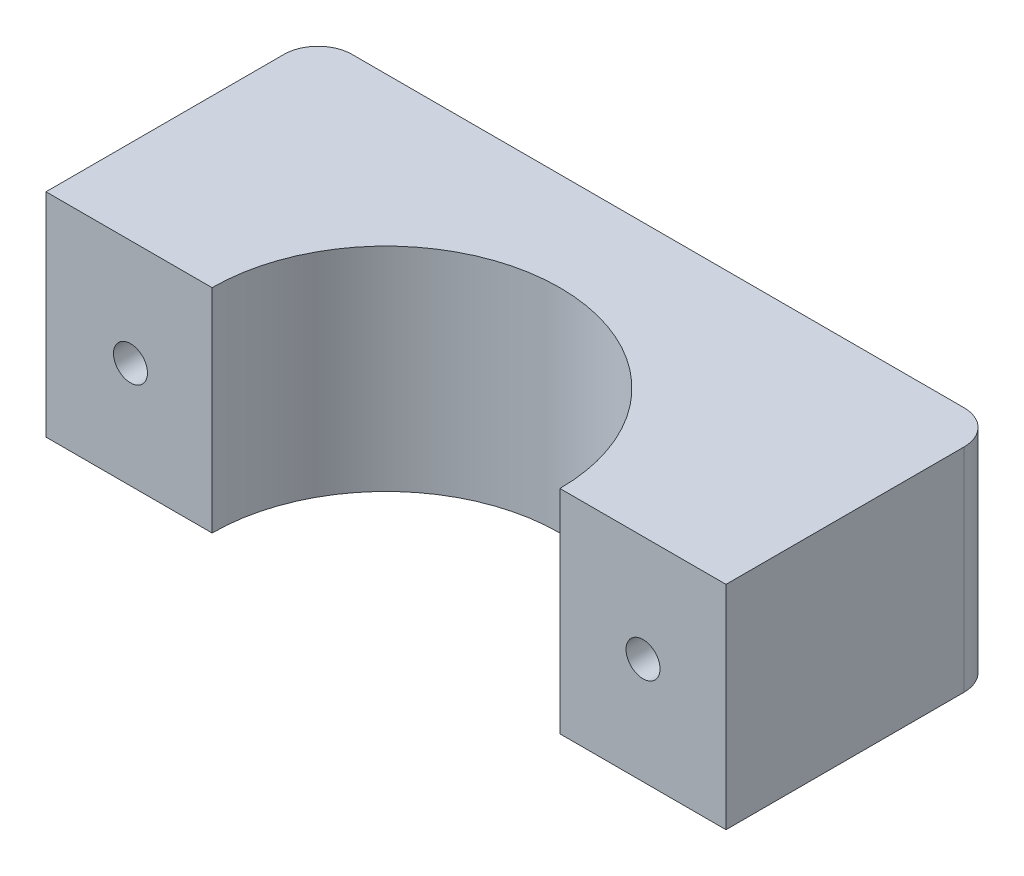
ISO-10303-21;
HEADER;
FILE_DESCRIPTION(('STEP AP214'),'2;1');
FILE_NAME('part.step','',(''),(''),'','','');
FILE_SCHEMA(('AUTOMOTIVE_DESIGN { 1 0 10303 214 1 1 1 1 }'));
ENDSEC;
DATA;
#1=APPLICATION_CONTEXT('core data for automotive mechanical design processes');
#2=APPLICATION_PROTOCOL_DEFINITION('international standard','automotive_design',2000,#1);
#3=PRODUCT_CONTEXT('',#1,'mechanical');
#4=PRODUCT('Part','Part','',(#3));
#5=PRODUCT_RELATED_PRODUCT_CATEGORY('part','',(#4));
#6=PRODUCT_DEFINITION_FORMATION('','',#4);
#7=PRODUCT_DEFINITION_CONTEXT('part definition',#1,'design');
#8=PRODUCT_DEFINITION('design','',#6,#7);
#9=PRODUCT_DEFINITION_SHAPE('','',#8);
#10=(LENGTH_UNIT() NAMED_UNIT(*) SI_UNIT(.MILLI.,.METRE.));
#11=(NAMED_UNIT(*) PLANE_ANGLE_UNIT() SI_UNIT($,.RADIAN.));
#12=(NAMED_UNIT(*) SI_UNIT($,.STERADIAN.) SOLID_ANGLE_UNIT());
#13=UNCERTAINTY_MEASURE_WITH_UNIT(LENGTH_MEASURE(1.E-05),#10,'distance_accuracy_value','');
#14=(GEOMETRIC_REPRESENTATION_CONTEXT(3) GLOBAL_UNCERTAINTY_ASSIGNED_CONTEXT((#13)) GLOBAL_UNIT_ASSIGNED_CONTEXT((#10,
#11,#12)) REPRESENTATION_CONTEXT('',''));
#15=CARTESIAN_POINT('',(0.,0.,0.));
#16=DIRECTION('',(0.,0.,1.));
#17=DIRECTION('',(1.,0.,0.));
#18=AXIS2_PLACEMENT_3D('',#15,#16,#17);
#19=CARTESIAN_POINT('',(44.6024,7.9375,0.));
#20=DIRECTION('',(0.,0.,1.));
#21=DIRECTION('',(1.,0.,0.));
#22=AXIS2_PLACEMENT_3D('',#19,#20,#21);
#23=CYLINDRICAL_SURFACE('',#22,1.27);
#24=CARTESIAN_POINT('',(44.6024,7.9375,20.32));
#25=DIRECTION('',(0.,0.,1.));
#26=DIRECTION('',(1.,0.,0.));
#27=AXIS2_PLACEMENT_3D('',#24,#25,#26);
#28=CIRCLE('',#27,1.27);
#29=CARTESIAN_POINT('',(45.8724,7.9375,20.32));
#30=VERTEX_POINT('',#29);
#31=EDGE_CURVE('E301',#30,#30,#28,.T.);
#32=ORIENTED_EDGE('',*,*,#31,.T.);
#33=EDGE_LOOP('',(#32));
#34=FACE_BOUND('',#33,.T.);
#35=CARTESIAN_POINT('',(44.6024,7.9375,4.1275));
#36=DIRECTION('',(0.,0.,-1.));
#37=DIRECTION('',(-1.,0.,0.));
#38=AXIS2_PLACEMENT_3D('',#35,#36,#37);
#39=CIRCLE('',#38,1.27);
#40=CARTESIAN_POINT('',(43.3324,7.9375,4.1275));
#41=VERTEX_POINT('',#40);
#42=EDGE_CURVE('E297',#41,#41,#39,.F.);
#43=ORIENTED_EDGE('',*,*,#42,.F.);
#44=EDGE_LOOP('',(#43));
#45=FACE_BOUND('',#44,.T.);
#46=ADVANCED_FACE('F41',(#34,#45),#23,.F.);
#47=CARTESIAN_POINT('',(6.3119,7.9375,0.));
#48=DIRECTION('',(0.,0.,1.));
#49=DIRECTION('',(1.,0.,0.));
#50=AXIS2_PLACEMENT_3D('',#47,#48,#49);
#51=CYLINDRICAL_SURFACE('',#50,1.27);
#52=CARTESIAN_POINT('',(6.3119,7.9375,20.32));
#53=DIRECTION('',(0.,0.,1.));
#54=DIRECTION('',(1.,0.,0.));
#55=AXIS2_PLACEMENT_3D('',#52,#53,#54);
#56=CIRCLE('',#55,1.27);
#57=CARTESIAN_POINT('',(7.5819,7.9375,20.32));
#58=VERTEX_POINT('',#57);
#59=EDGE_CURVE('E146',#58,#58,#56,.T.);
#60=ORIENTED_EDGE('',*,*,#59,.T.);
#61=EDGE_LOOP('',(#60));
#62=FACE_BOUND('',#61,.T.);
#63=CARTESIAN_POINT('',(6.3119,7.9375,4.1275));
#64=DIRECTION('',(0.,0.,-1.));
#65=DIRECTION('',(-1.,0.,0.));
#66=AXIS2_PLACEMENT_3D('',#63,#64,#65);
#67=CIRCLE('',#66,1.27);
#68=CARTESIAN_POINT('',(5.04189999999999,7.9375,4.1275));
#69=VERTEX_POINT('',#68);
#70=EDGE_CURVE('E294',#69,#69,#67,.F.);
#71=ORIENTED_EDGE('',*,*,#70,.F.);
#72=EDGE_LOOP('',(#71));
#73=FACE_BOUND('',#72,.T.);
#74=ADVANCED_FACE('F208',(#62,#73),#51,.F.);
#75=CARTESIAN_POINT('',(0.,15.875,0.));
#76=DIRECTION('',(0.,0.,-1.));
#77=DIRECTION('',(-1.,0.,0.));
#78=AXIS2_PLACEMENT_3D('',#75,#76,#77);
#79=PLANE('',#78);
#80=CARTESIAN_POINT('',(44.6024,7.9375,0.));
#81=DIRECTION('',(0.,0.,-1.));
#82=DIRECTION('',(-1.,0.,0.));
#83=AXIS2_PLACEMENT_3D('',#80,#81,#82);
#84=CIRCLE('',#83,3.81);
#85=CARTESIAN_POINT('',(48.26,6.87069999999999,0.));
#86=VERTEX_POINT('',#85);
#87=CARTESIAN_POINT('',(48.26,9.00430000000001,0.));
#88=VERTEX_POINT('',#87);
#89=EDGE_CURVE('E68',#86,#88,#84,.T.);
#90=ORIENTED_EDGE('',*,*,#89,.F.);
#91=DIRECTION('',(0.,-1.,0.));
#92=VECTOR('',#91,1.);
#93=CARTESIAN_POINT('',(48.26,15.875,0.));
#94=LINE('',#93,#92);
#95=CARTESIAN_POINT('',(48.26,0.,0.));
#96=VERTEX_POINT('',#95);
#97=EDGE_CURVE('E129',#86,#96,#94,.T.);
#98=ORIENTED_EDGE('',*,*,#97,.T.);
#99=DIRECTION('',(1.,0.,0.));
#100=VECTOR('',#99,1.);
#101=CARTESIAN_POINT('',(0.,0.,0.));
#102=LINE('',#101,#100);
#103=CARTESIAN_POINT('',(2.54000000000002,0.,0.));
#104=VERTEX_POINT('',#103);
#105=EDGE_CURVE('E132',#104,#96,#102,.T.);
#106=ORIENTED_EDGE('',*,*,#105,.F.);
#107=DIRECTION('',(0.,-1.,0.));
#108=VECTOR('',#107,1.);
#109=CARTESIAN_POINT('',(2.54000000000002,15.875,0.));
#110=LINE('',#109,#108);
#111=CARTESIAN_POINT('',(2.54000000000001,7.40003335917463,0.));
#112=VERTEX_POINT('',#111);
#113=EDGE_CURVE('E233',#112,#104,#110,.T.);
#114=ORIENTED_EDGE('',*,*,#113,.F.);
#115=CARTESIAN_POINT('',(6.3119,7.9375,0.));
#116=DIRECTION('',(0.,0.,-1.));
#117=DIRECTION('',(-1.,0.,0.));
#118=AXIS2_PLACEMENT_3D('',#115,#116,#117);
#119=CIRCLE('',#118,3.81);
#120=CARTESIAN_POINT('',(2.54000000000001,8.47496664082536,0.));
#121=VERTEX_POINT('',#120);
#122=EDGE_CURVE('E61',#121,#112,#119,.T.);
#123=ORIENTED_EDGE('',*,*,#122,.F.);
#124=CARTESIAN_POINT('',(2.54000000000002,15.875,0.));
#125=VERTEX_POINT('',#124);
#126=EDGE_CURVE('E231',#125,#121,#110,.T.);
#127=ORIENTED_EDGE('',*,*,#126,.F.);
#128=DIRECTION('',(1.,0.,0.));
#129=VECTOR('',#128,1.);
#130=CARTESIAN_POINT('',(0.,15.875,0.));
#131=LINE('',#130,#129);
#132=CARTESIAN_POINT('',(48.26,15.875,0.));
#133=VERTEX_POINT('',#132);
#134=EDGE_CURVE('E150',#125,#133,#131,.T.);
#135=ORIENTED_EDGE('',*,*,#134,.T.);
#136=EDGE_CURVE('E135',#133,#88,#94,.T.);
#137=ORIENTED_EDGE('',*,*,#136,.T.);
#138=EDGE_LOOP('',(#90,#98,#106,#114,#123,#127,#135,#137));
#139=FACE_BOUND('',#138,.T.);
#140=ADVANCED_FACE('F43',(#139),#79,.T.);
#141=CARTESIAN_POINT('',(2.54,15.875,2.54));
#142=DIRECTION('',(0.,-1.,0.));
#143=DIRECTION('',(0.,0.,-1.));
#144=AXIS2_PLACEMENT_3D('',#141,#142,#143);
#145=CYLINDRICAL_SURFACE('',#144,2.54);
#146=ORIENTED_EDGE('',*,*,#126,.T.);
#147=CARTESIAN_POINT('',(2.54,8.4749666408253,0.));
#148=CARTESIAN_POINT('',(2.52728420261539,8.38576587382228,2.37479783638258E-05));
#149=CARTESIAN_POINT('',(2.51774332617313,8.29611346442367,9.54874322437324E-05));
#150=CARTESIAN_POINT('',(2.50506706168922,8.11680587751478,0.000226466232984405));
#151=CARTESIAN_POINT('',(2.5019,8.02715293875739,0.000285766071629371));
#152=CARTESIAN_POINT('',(2.5019,7.84784706124261,0.000285766071629377));
#153=CARTESIAN_POINT('',(2.50506706168922,7.75819412248522,0.000226466232984417));
#154=CARTESIAN_POINT('',(2.51774332617313,7.57888653557632,9.54874322437574E-05));
#155=CARTESIAN_POINT('',(2.52728420261539,7.48923412617772,2.37479783638568E-05));
#156=CARTESIAN_POINT('',(2.54,7.4000333591747,0.));
#157=B_SPLINE_CURVE_WITH_KNOTS('',3,(#147,#148,#149,#150,#151,#152,#153,#154,#155,#156),
.UNSPECIFIED.,.F.,.F.,(4,2,2,2,4),(0.,0.270249625934632,0.539152940522524,0.808056255110416,
1.07830588104505),.UNSPECIFIED.);
#158=EDGE_CURVE('E11',#121,#112,#157,.T.);
#159=ORIENTED_EDGE('',*,*,#158,.T.);
#160=ORIENTED_EDGE('',*,*,#113,.T.);
#161=CARTESIAN_POINT('',(2.54,0.,2.54));
#162=DIRECTION('',(0.,1.,0.));
#163=DIRECTION('',(0.,0.,1.));
#164=AXIS2_PLACEMENT_3D('',#161,#162,#163);
#165=CIRCLE('',#164,2.54);
#166=CARTESIAN_POINT('',(0.,0.,2.54000000000002));
#167=VERTEX_POINT('',#166);
#168=EDGE_CURVE('E144',#104,#167,#165,.T.);
#169=ORIENTED_EDGE('',*,*,#168,.T.);
#170=DIRECTION('',(0.,-1.,0.));
#171=VECTOR('',#170,1.);
#172=CARTESIAN_POINT('',(0.,15.875,2.54000000000002));
#173=LINE('',#172,#171);
#174=CARTESIAN_POINT('',(0.,15.875,2.54000000000002));
#175=VERTEX_POINT('',#174);
#176=EDGE_CURVE('E236',#175,#167,#173,.T.);
#177=ORIENTED_EDGE('',*,*,#176,.F.);
#178=CARTESIAN_POINT('',(2.54,15.875,2.54));
#179=DIRECTION('',(0.,1.,0.));
#180=DIRECTION('',(0.,0.,1.));
#181=AXIS2_PLACEMENT_3D('',#178,#179,#180);
#182=CIRCLE('',#181,2.54);
#183=EDGE_CURVE('E156',#125,#175,#182,.T.);
#184=ORIENTED_EDGE('',*,*,#183,.F.);
#185=EDGE_LOOP('',(#146,#159,#160,#169,#177,#184));
#186=FACE_BOUND('',#185,.T.);
#187=ADVANCED_FACE('F200',(#186),#145,.T.);
#188=CARTESIAN_POINT('',(0.,15.875,0.));
#189=DIRECTION('',(1.,0.,0.));
#190=DIRECTION('',(0.,0.,-1.));
#191=AXIS2_PLACEMENT_3D('',#188,#189,#190);
#192=PLANE('',#191);
#193=DIRECTION('',(0.,0.,1.));
#194=VECTOR('',#193,1.);
#195=CARTESIAN_POINT('',(0.,0.,0.));
#196=LINE('',#195,#194);
#197=CARTESIAN_POINT('',(0.,0.,20.32));
#198=VERTEX_POINT('',#197);
#199=EDGE_CURVE('E261',#167,#198,#196,.T.);
#200=ORIENTED_EDGE('',*,*,#199,.T.);
#201=DIRECTION('',(0.,-1.,0.));
#202=VECTOR('',#201,1.);
#203=CARTESIAN_POINT('',(0.,15.875,20.32));
#204=LINE('',#203,#202);
#205=CARTESIAN_POINT('',(0.,15.875,20.32));
#206=VERTEX_POINT('',#205);
#207=EDGE_CURVE('E288',#206,#198,#204,.T.);
#208=ORIENTED_EDGE('',*,*,#207,.F.);
#209=DIRECTION('',(0.,0.,1.));
#210=VECTOR('',#209,1.);
#211=CARTESIAN_POINT('',(0.,15.875,0.));
#212=LINE('',#211,#210);
#213=EDGE_CURVE('E239',#175,#206,#212,.T.);
#214=ORIENTED_EDGE('',*,*,#213,.F.);
#215=ORIENTED_EDGE('',*,*,#176,.T.);
#216=EDGE_LOOP('',(#200,#208,#214,#215));
#217=FACE_BOUND('',#216,.T.);
#218=ADVANCED_FACE('F198',(#217),#192,.F.);
#219=CARTESIAN_POINT('',(0.,15.875,20.32));
#220=DIRECTION('',(0.,0.,-1.));
#221=DIRECTION('',(-1.,0.,0.));
#222=AXIS2_PLACEMENT_3D('',#219,#220,#221);
#223=PLANE('',#222);
#224=ORIENTED_EDGE('',*,*,#59,.F.);
#225=EDGE_LOOP('',(#224));
#226=FACE_BOUND('',#225,.T.);
#227=DIRECTION('',(1.,0.,0.));
#228=VECTOR('',#227,1.);
#229=CARTESIAN_POINT('',(0.,0.,20.32));
#230=LINE('',#229,#228);
#231=CARTESIAN_POINT('',(12.4079,0.,20.32));
#232=VERTEX_POINT('',#231);
#233=EDGE_CURVE('E264',#198,#232,#230,.T.);
#234=ORIENTED_EDGE('',*,*,#233,.T.);
#235=DIRECTION('',(0.,-1.,0.));
#236=VECTOR('',#235,1.);
#237=CARTESIAN_POINT('',(12.4079,15.875,20.32));
#238=LINE('',#237,#236);
#239=CARTESIAN_POINT('',(12.4079,15.875,20.32));
#240=VERTEX_POINT('',#239);
#241=EDGE_CURVE('E283',#240,#232,#238,.T.);
#242=ORIENTED_EDGE('',*,*,#241,.F.);
#243=DIRECTION('',(1.,0.,0.));
#244=VECTOR('',#243,1.);
#245=CARTESIAN_POINT('',(0.,15.875,20.32));
#246=LINE('',#245,#244);
#247=EDGE_CURVE('E242',#206,#240,#246,.T.);
#248=ORIENTED_EDGE('',*,*,#247,.F.);
#249=ORIENTED_EDGE('',*,*,#207,.T.);
#250=EDGE_LOOP('',(#234,#242,#248,#249));
#251=FACE_BOUND('',#250,.T.);
#252=ADVANCED_FACE('F194',(#226,#251),#223,.F.);
#253=CARTESIAN_POINT('',(25.4,15.875,20.32));
#254=DIRECTION('',(0.,-1.,0.));
#255=DIRECTION('',(0.,0.,-1.));
#256=AXIS2_PLACEMENT_3D('',#253,#254,#255);
#257=CYLINDRICAL_SURFACE('',#256,12.9921);
#258=CARTESIAN_POINT('',(25.4,0.,20.32));
#259=DIRECTION('',(0.,1.,0.));
#260=DIRECTION('',(0.,0.,1.));
#261=AXIS2_PLACEMENT_3D('',#258,#259,#260);
#262=CIRCLE('',#261,12.9921);
#263=CARTESIAN_POINT('',(38.3921,0.,20.32));
#264=VERTEX_POINT('',#263);
#265=EDGE_CURVE('E267',#264,#232,#262,.T.);
#266=ORIENTED_EDGE('',*,*,#265,.F.);
#267=DIRECTION('',(0.,-1.,0.));
#268=VECTOR('',#267,1.);
#269=CARTESIAN_POINT('',(38.3921,15.875,20.32));
#270=LINE('',#269,#268);
#271=CARTESIAN_POINT('',(38.3921,15.875,20.32));
#272=VERTEX_POINT('',#271);
#273=EDGE_CURVE('E279',#272,#264,#270,.T.);
#274=ORIENTED_EDGE('',*,*,#273,.F.);
#275=CARTESIAN_POINT('',(25.4,15.875,20.32));
#276=DIRECTION('',(0.,1.,0.));
#277=DIRECTION('',(0.,0.,1.));
#278=AXIS2_PLACEMENT_3D('',#275,#276,#277);
#279=CIRCLE('',#278,12.9921);
#280=EDGE_CURVE('E248',#272,#240,#279,.T.);
#281=ORIENTED_EDGE('',*,*,#280,.T.);
#282=ORIENTED_EDGE('',*,*,#241,.T.);
#283=EDGE_LOOP('',(#266,#274,#281,#282));
#284=FACE_BOUND('',#283,.T.);
#285=ADVANCED_FACE('F192',(#284),#257,.F.);
#286=ORIENTED_EDGE('',*,*,#31,.F.);
#287=EDGE_LOOP('',(#286));
#288=FACE_BOUND('',#287,.T.);
#289=CARTESIAN_POINT('',(50.8,0.,20.32));
#290=VERTEX_POINT('',#289);
#291=EDGE_CURVE('E158',#264,#290,#230,.T.);
#292=ORIENTED_EDGE('',*,*,#291,.T.);
#293=DIRECTION('',(0.,-1.,0.));
#294=VECTOR('',#293,1.);
#295=CARTESIAN_POINT('',(50.8,15.875,20.32));
#296=LINE('',#295,#294);
#297=CARTESIAN_POINT('',(50.8,15.875,20.32));
#298=VERTEX_POINT('',#297);
#299=EDGE_CURVE('E278',#298,#290,#296,.T.);
#300=ORIENTED_EDGE('',*,*,#299,.F.);
#301=EDGE_CURVE('E249',#272,#298,#246,.T.);
#302=ORIENTED_EDGE('',*,*,#301,.F.);
#303=ORIENTED_EDGE('',*,*,#273,.T.);
#304=EDGE_LOOP('',(#292,#300,#302,#303));
#305=FACE_BOUND('',#304,.T.);
#306=ADVANCED_FACE('F188',(#288,#305),#223,.F.);
#307=CARTESIAN_POINT('',(50.8,15.875,0.));
#308=DIRECTION('',(1.,0.,0.));
#309=DIRECTION('',(0.,0.,-1.));
#310=AXIS2_PLACEMENT_3D('',#307,#308,#309);
#311=PLANE('',#310);
#312=DIRECTION('',(0.,0.,1.));
#313=VECTOR('',#312,1.);
#314=CARTESIAN_POINT('',(50.8,0.,0.));
#315=LINE('',#314,#313);
#316=CARTESIAN_POINT('',(50.8,0.,2.54000000000002));
#317=VERTEX_POINT('',#316);
#318=EDGE_CURVE('E151',#317,#290,#315,.T.);
#319=ORIENTED_EDGE('',*,*,#318,.F.);
#320=DIRECTION('',(0.,-1.,0.));
#321=VECTOR('',#320,1.);
#322=CARTESIAN_POINT('',(50.8,15.875,2.54000000000002));
#323=LINE('',#322,#321);
#324=CARTESIAN_POINT('',(50.8,15.875,2.54000000000002));
#325=VERTEX_POINT('',#324);
#326=EDGE_CURVE('E123',#325,#317,#323,.T.);
#327=ORIENTED_EDGE('',*,*,#326,.F.);
#328=DIRECTION('',(0.,0.,1.));
#329=VECTOR('',#328,1.);
#330=CARTESIAN_POINT('',(50.8,15.875,0.));
#331=LINE('',#330,#329);
#332=EDGE_CURVE('E253',#325,#298,#331,.T.);
#333=ORIENTED_EDGE('',*,*,#332,.T.);
#334=ORIENTED_EDGE('',*,*,#299,.T.);
#335=EDGE_LOOP('',(#319,#327,#333,#334));
#336=FACE_BOUND('',#335,.T.);
#337=ADVANCED_FACE('F184',(#336),#311,.T.);
#338=CARTESIAN_POINT('',(48.26,15.875,2.54));
#339=DIRECTION('',(0.,-1.,0.));
#340=DIRECTION('',(0.,0.,-1.));
#341=AXIS2_PLACEMENT_3D('',#338,#339,#340);
#342=CYLINDRICAL_SURFACE('',#341,2.54);
#343=CARTESIAN_POINT('',(48.26,9.00430000000008,0.));
#344=CARTESIAN_POINT('',(48.2767664271567,8.94681915115248,-1.32472025406618E-06));
#345=CARTESIAN_POINT('',(48.2921756779361,8.88894254359757,4.17083391619791E-05));
#346=CARTESIAN_POINT('',(48.3202504153357,8.77252762471452,0.000212515522361404));
#347=CARTESIAN_POINT('',(48.3329158964594,8.71398931206105,0.000340289815905089));
#348=CARTESIAN_POINT('',(48.3554736609219,8.59638079235764,0.000676605619593211));
#349=CARTESIAN_POINT('',(48.3653659331493,8.53731058317753,0.000885147453340479));
#350=CARTESIAN_POINT('',(48.3823556387873,8.41876950618299,0.00140286731633203));
#351=CARTESIAN_POINT('',(48.3894530554007,8.35929863596275,0.0017120459503867));
#352=CARTESIAN_POINT('',(48.4008372227079,8.24008885752648,0.00235553567481537));
#353=CARTESIAN_POINT('',(48.4051239508789,8.18034994716642,0.0026898469665605));
#354=CARTESIAN_POINT('',(48.4108771207839,8.0607350794502,0.00366575018185836));
#355=CARTESIAN_POINT('',(48.4123435342685,8.00085912072731,0.00430734518320203));
#356=CARTESIAN_POINT('',(48.4124300440038,7.90646295020399,0.00473094081845372));
#357=CARTESIAN_POINT('',(48.4119924336915,7.8719416128928,0.00476188503032033));
#358=CARTESIAN_POINT('',(48.4095020825585,7.77716571480468,0.00464984252720054));
#359=CARTESIAN_POINT('',(48.4064877361521,7.71693268905106,0.00435982396923617));
#360=CARTESIAN_POINT('',(48.3991138845178,7.61711126419718,0.00385167760206996));
#361=CARTESIAN_POINT('',(48.3955591456342,7.57746037437198,0.00364259448423007));
#362=CARTESIAN_POINT('',(48.3865330804454,7.49188219082923,0.00315158872344298));
#363=CARTESIAN_POINT('',(48.3808447033551,7.44597746759608,0.0028633542331035));
#364=CARTESIAN_POINT('',(48.3683245726252,7.35808554728794,0.00230803354872441));
#365=CARTESIAN_POINT('',(48.3616214231416,7.31607995862014,0.0020411090762523));
#366=CARTESIAN_POINT('',(48.3476770897407,7.23720651227612,0.00156358611987761));
#367=CARTESIAN_POINT('',(48.3405900315325,7.20031125661978,0.00135004974361604));
#368=CARTESIAN_POINT('',(48.3207216489097,7.10454649588739,0.00081369563252836));
#369=CARTESIAN_POINT('',(48.3070848356992,7.04585171638598,0.000502689165292071));
#370=CARTESIAN_POINT('',(48.2819964986111,6.94840855430246,0.000140751917042708));
#371=CARTESIAN_POINT('',(48.271306377258,6.90946282877064,3.78849351521569E-05));
#372=CARTESIAN_POINT('',(48.26,6.87069999999992,0.));
#373=B_SPLINE_CURVE_WITH_KNOTS('',3,(#343,#344,#345,#346,#347,#348,#349,#350,#351,#352,#353,
#354,#355,#356,#357,#358,#359,#360,#361,#362,#363,#364,#365,#366,#367,#368,#369,#370,#371,#372),
.UNSPECIFIED.,.F.,.F.,(4,2,2,2,2,2,2,2,2,2,2,2,2,2,4),(0.,0.179611860160987,0.359224080135667,
0.538837019751232,0.71845103883055,0.898066497190009,1.07768375463733,1.18124624186789,
1.36209383283098,1.48150898400612,1.62024664474203,1.74783612818668,1.86053302845808,
2.04123491869818,2.16237154745122),.UNSPECIFIED.);
#374=EDGE_CURVE('E55',#88,#86,#373,.T.);
#375=ORIENTED_EDGE('',*,*,#374,.F.);
#376=ORIENTED_EDGE('',*,*,#136,.F.);
#377=CARTESIAN_POINT('',(48.26,15.875,2.54));
#378=DIRECTION('',(0.,1.,0.));
#379=DIRECTION('',(0.,0.,1.));
#380=AXIS2_PLACEMENT_3D('',#377,#378,#379);
#381=CIRCLE('',#380,2.54);
#382=EDGE_CURVE('E136',#133,#325,#381,.F.);
#383=ORIENTED_EDGE('',*,*,#382,.T.);
#384=ORIENTED_EDGE('',*,*,#326,.T.);
#385=CARTESIAN_POINT('',(48.26,0.,2.54));
#386=DIRECTION('',(0.,1.,0.));
#387=DIRECTION('',(0.,0.,1.));
#388=AXIS2_PLACEMENT_3D('',#385,#386,#387);
#389=CIRCLE('',#388,2.54);
#390=EDGE_CURVE('E142',#96,#317,#389,.F.);
#391=ORIENTED_EDGE('',*,*,#390,.F.);
#392=ORIENTED_EDGE('',*,*,#97,.F.);
#393=EDGE_LOOP('',(#375,#376,#383,#384,#391,#392));
#394=FACE_BOUND('',#393,.T.);
#395=ADVANCED_FACE('F148',(#394),#342,.T.);
#396=CARTESIAN_POINT('',(0.,15.875,0.));
#397=DIRECTION('',(0.,1.,0.));
#398=DIRECTION('',(0.,0.,1.));
#399=AXIS2_PLACEMENT_3D('',#396,#397,#398);
#400=PLANE('',#399);
#401=ORIENTED_EDGE('',*,*,#134,.F.);
#402=ORIENTED_EDGE('',*,*,#183,.T.);
#403=ORIENTED_EDGE('',*,*,#213,.T.);
#404=ORIENTED_EDGE('',*,*,#247,.T.);
#405=ORIENTED_EDGE('',*,*,#280,.F.);
#406=ORIENTED_EDGE('',*,*,#301,.T.);
#407=ORIENTED_EDGE('',*,*,#332,.F.);
#408=ORIENTED_EDGE('',*,*,#382,.F.);
#409=EDGE_LOOP('',(#401,#402,#403,#404,#405,#406,#407,#408));
#410=FACE_BOUND('',#409,.T.);
#411=ADVANCED_FACE('F183',(#410),#400,.T.);
#412=CARTESIAN_POINT('',(0.,0.,0.));
#413=DIRECTION('',(0.,1.,0.));
#414=DIRECTION('',(0.,0.,1.));
#415=AXIS2_PLACEMENT_3D('',#412,#413,#414);
#416=PLANE('',#415);
#417=ORIENTED_EDGE('',*,*,#105,.T.);
#418=ORIENTED_EDGE('',*,*,#390,.T.);
#419=ORIENTED_EDGE('',*,*,#318,.T.);
#420=ORIENTED_EDGE('',*,*,#291,.F.);
#421=ORIENTED_EDGE('',*,*,#265,.T.);
#422=ORIENTED_EDGE('',*,*,#233,.F.);
#423=ORIENTED_EDGE('',*,*,#199,.F.);
#424=ORIENTED_EDGE('',*,*,#168,.F.);
#425=EDGE_LOOP('',(#417,#418,#419,#420,#421,#422,#423,#424));
#426=FACE_BOUND('',#425,.T.);
#427=ADVANCED_FACE('F140',(#426),#416,.F.);
#428=CARTESIAN_POINT('',(6.3119,7.9375,4.1275));
#429=DIRECTION('',(0.,0.,-1.));
#430=DIRECTION('',(-1.,0.,0.));
#431=AXIS2_PLACEMENT_3D('',#428,#429,#430);
#432=CYLINDRICAL_SURFACE('',#431,3.81);
#433=CARTESIAN_POINT('',(6.3119,7.9375,4.1275));
#434=DIRECTION('',(0.,0.,-1.));
#435=DIRECTION('',(-1.,0.,0.));
#436=AXIS2_PLACEMENT_3D('',#433,#434,#435);
#437=CIRCLE('',#436,3.81);
#438=CARTESIAN_POINT('',(2.5019,7.9375,4.1275));
#439=VERTEX_POINT('',#438);
#440=EDGE_CURVE('E313',#439,#439,#437,.T.);
#441=ORIENTED_EDGE('',*,*,#440,.F.);
#442=EDGE_LOOP('',(#441));
#443=FACE_BOUND('',#442,.T.);
#444=ORIENTED_EDGE('',*,*,#122,.T.);
#445=ORIENTED_EDGE('',*,*,#158,.F.);
#446=EDGE_LOOP('',(#444,#445));
#447=FACE_BOUND('',#446,.T.);
#448=ADVANCED_FACE('F225',(#443,#447),#432,.F.);
#449=CARTESIAN_POINT('',(6.3119,7.9375,4.1275));
#450=DIRECTION('',(0.,0.,-1.));
#451=DIRECTION('',(-1.,0.,0.));
#452=AXIS2_PLACEMENT_3D('',#449,#450,#451);
#453=PLANE('',#452);
#454=ORIENTED_EDGE('',*,*,#440,.T.);
#455=EDGE_LOOP('',(#454));
#456=FACE_BOUND('',#455,.T.);
#457=ORIENTED_EDGE('',*,*,#70,.T.);
#458=EDGE_LOOP('',(#457));
#459=FACE_BOUND('',#458,.T.);
#460=ADVANCED_FACE('F335',(#456,#459),#453,.T.);
#461=CARTESIAN_POINT('',(44.6024,7.9375,4.1275));
#462=DIRECTION('',(0.,0.,-1.));
#463=DIRECTION('',(-1.,0.,0.));
#464=AXIS2_PLACEMENT_3D('',#461,#462,#463);
#465=PLANE('',#464);
#466=CARTESIAN_POINT('',(44.6024,7.9375,4.1275));
#467=DIRECTION('',(0.,0.,-1.));
#468=DIRECTION('',(-1.,0.,0.));
#469=AXIS2_PLACEMENT_3D('',#466,#467,#468);
#470=CIRCLE('',#469,3.81);
#471=CARTESIAN_POINT('',(40.7924,7.9375,4.1275));
#472=VERTEX_POINT('',#471);
#473=EDGE_CURVE('E298',#472,#472,#470,.T.);
#474=ORIENTED_EDGE('',*,*,#473,.T.);
#475=EDGE_LOOP('',(#474));
#476=FACE_BOUND('',#475,.T.);
#477=ORIENTED_EDGE('',*,*,#42,.T.);
#478=EDGE_LOOP('',(#477));
#479=FACE_BOUND('',#478,.T.);
#480=ADVANCED_FACE('F328',(#476,#479),#465,.T.);
#481=CARTESIAN_POINT('',(44.6024,7.9375,4.1275));
#482=DIRECTION('',(0.,0.,-1.));
#483=DIRECTION('',(-1.,0.,0.));
#484=AXIS2_PLACEMENT_3D('',#481,#482,#483);
#485=CYLINDRICAL_SURFACE('',#484,3.81);
#486=ORIENTED_EDGE('',*,*,#374,.T.);
#487=ORIENTED_EDGE('',*,*,#89,.T.);
#488=EDGE_LOOP('',(#486,#487));
#489=FACE_BOUND('',#488,.T.);
#490=ORIENTED_EDGE('',*,*,#473,.F.);
#491=EDGE_LOOP('',(#490));
#492=FACE_BOUND('',#491,.T.);
#493=ADVANCED_FACE('F330',(#489,#492),#485,.F.);
#494=CLOSED_SHELL('',(#46,#74,#140,#187,#218,#252,#285,#306,#337,#395,#411,#427,#448,#460,#480,#493));
#495=MANIFOLD_SOLID_BREP('B2',#494);
#496=ADVANCED_BREP_SHAPE_REPRESENTATION('',(#18,#495),#14);
#497=SHAPE_DEFINITION_REPRESENTATION(#9,#496);
ENDSEC;
END-ISO-10303-21;
